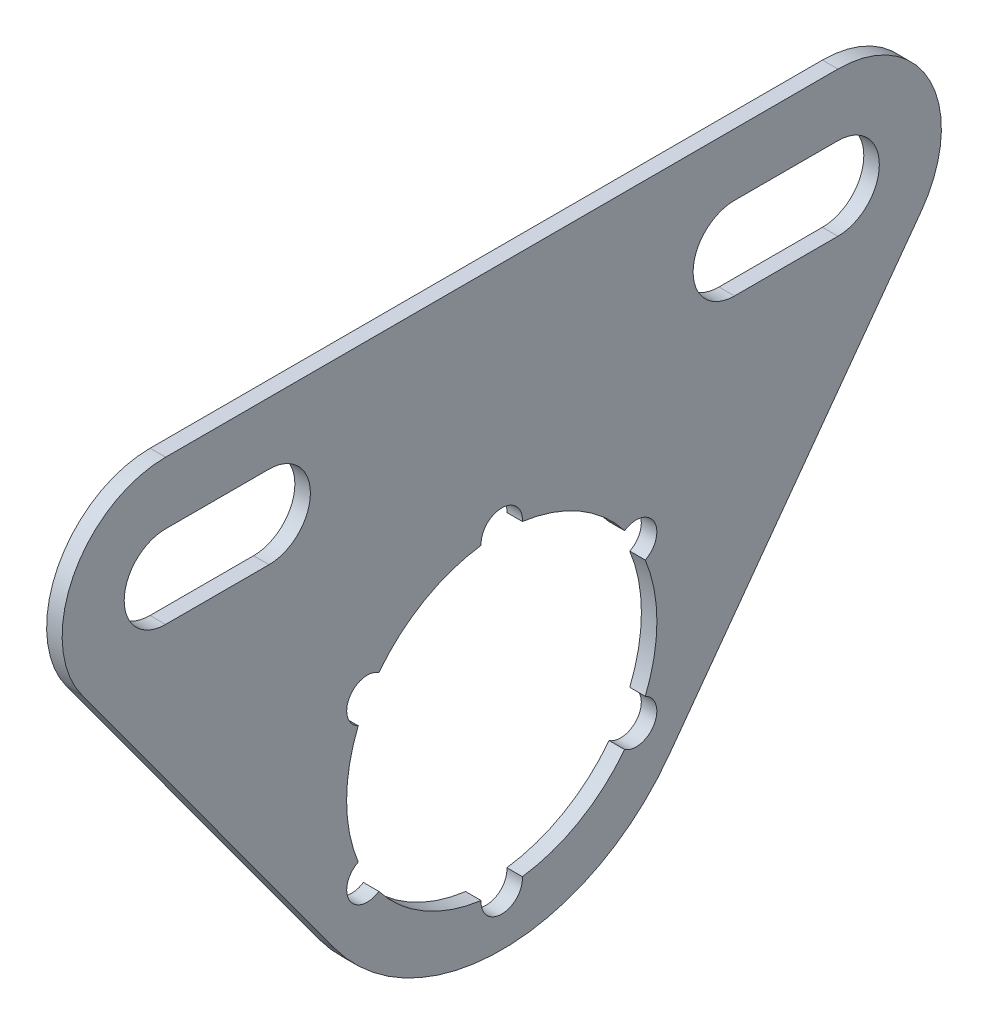
ISO-10303-21;
HEADER;
FILE_DESCRIPTION(('STEP AP214'),'2;1');
FILE_NAME('part.step','',(''),(''),'','','');
FILE_SCHEMA(('AUTOMOTIVE_DESIGN { 1 0 10303 214 1 1 1 1 }'));
ENDSEC;
DATA;
#1=APPLICATION_CONTEXT('core data for automotive mechanical design processes');
#2=APPLICATION_PROTOCOL_DEFINITION('international standard','automotive_design',2000,#1);
#3=PRODUCT_CONTEXT('',#1,'mechanical');
#4=PRODUCT('Part','Part','',(#3));
#5=PRODUCT_RELATED_PRODUCT_CATEGORY('part','',(#4));
#6=PRODUCT_DEFINITION_FORMATION('','',#4);
#7=PRODUCT_DEFINITION_CONTEXT('part definition',#1,'design');
#8=PRODUCT_DEFINITION('design','',#6,#7);
#9=PRODUCT_DEFINITION_SHAPE('','',#8);
#10=(LENGTH_UNIT() NAMED_UNIT(*) SI_UNIT(.MILLI.,.METRE.));
#11=(NAMED_UNIT(*) PLANE_ANGLE_UNIT() SI_UNIT($,.RADIAN.));
#12=(NAMED_UNIT(*) SI_UNIT($,.STERADIAN.) SOLID_ANGLE_UNIT());
#13=UNCERTAINTY_MEASURE_WITH_UNIT(LENGTH_MEASURE(1.E-05),#10,'distance_accuracy_value','');
#14=(GEOMETRIC_REPRESENTATION_CONTEXT(3) GLOBAL_UNCERTAINTY_ASSIGNED_CONTEXT((#13)) GLOBAL_UNIT_ASSIGNED_CONTEXT((#10,
#11,#12)) REPRESENTATION_CONTEXT('',''));
#15=CARTESIAN_POINT('',(0.,0.,0.));
#16=DIRECTION('',(0.,0.,1.));
#17=DIRECTION('',(1.,0.,0.));
#18=AXIS2_PLACEMENT_3D('',#15,#16,#17);
#19=CARTESIAN_POINT('',(3.,-23.6121778819599,32.2872274385817));
#20=DIRECTION('',(0.,0.590304447048994,-0.807180685964538));
#21=DIRECTION('',(0.,0.807180685964538,0.590304447048994));
#22=AXIS2_PLACEMENT_3D('',#19,#20,#21);
#23=PLANE('',#22);
#24=DIRECTION('',(0.,-0.807180685964538,-0.590304447048994));
#25=VECTOR('',#24,1.);
#26=CARTESIAN_POINT('',(0.,-23.6121778819599,32.2872274385817));
#27=LINE('',#26,#25);
#28=CARTESIAN_POINT('',(0.,43.1939110590199,81.1436137192905));
#29=VERTEX_POINT('',#28);
#30=CARTESIAN_POINT('',(0.,-23.6121778819604,32.2872274385814));
#31=VERTEX_POINT('',#30);
#32=EDGE_CURVE('E305',#29,#31,#27,.T.);
#33=ORIENTED_EDGE('',*,*,#32,.T.);
#34=DIRECTION('',(-1.,0.,0.));
#35=VECTOR('',#34,1.);
#36=CARTESIAN_POINT('',(3.,-23.6121778819604,32.2872274385814));
#37=LINE('',#36,#35);
#38=CARTESIAN_POINT('',(3.,-23.6121778819604,32.2872274385814));
#39=VERTEX_POINT('',#38);
#40=EDGE_CURVE('E11',#39,#31,#37,.T.);
#41=ORIENTED_EDGE('',*,*,#40,.F.);
#42=DIRECTION('',(0.,-0.807180685964538,-0.590304447048994));
#43=VECTOR('',#42,1.);
#44=CARTESIAN_POINT('',(3.,-23.6121778819599,32.2872274385817));
#45=LINE('',#44,#43);
#46=CARTESIAN_POINT('',(3.,43.1939110590199,81.1436137192905));
#47=VERTEX_POINT('',#46);
#48=EDGE_CURVE('E434',#47,#39,#45,.T.);
#49=ORIENTED_EDGE('',*,*,#48,.F.);
#50=DIRECTION('',(-1.,0.,0.));
#51=VECTOR('',#50,1.);
#52=CARTESIAN_POINT('',(3.,43.1939110590199,81.1436137192905));
#53=LINE('',#52,#51);
#54=EDGE_CURVE('E319',#47,#29,#53,.T.);
#55=ORIENTED_EDGE('',*,*,#54,.T.);
#56=EDGE_LOOP('',(#33,#41,#49,#55));
#57=FACE_BOUND('',#56,.T.);
#58=ADVANCED_FACE('F39',(#57),#23,.F.);
#59=CARTESIAN_POINT('',(3.,0.,0.));
#60=DIRECTION('',(-1.,0.,0.));
#61=DIRECTION('',(0.,0.,1.));
#62=AXIS2_PLACEMENT_3D('',#59,#60,#61);
#63=CYLINDRICAL_SURFACE('',#62,40.0000000000002);
#64=CARTESIAN_POINT('',(0.,0.,0.));
#65=DIRECTION('',(1.,0.,0.));
#66=DIRECTION('',(0.,0.,-1.));
#67=AXIS2_PLACEMENT_3D('',#64,#65,#66);
#68=CIRCLE('',#67,40.0000000000002);
#69=CARTESIAN_POINT('',(0.,-23.6121778819604,-32.2872274385814));
#70=VERTEX_POINT('',#69);
#71=EDGE_CURVE('E308',#31,#70,#68,.T.);
#72=ORIENTED_EDGE('',*,*,#71,.T.);
#73=DIRECTION('',(-1.,0.,0.));
#74=VECTOR('',#73,1.);
#75=CARTESIAN_POINT('',(3.,-23.6121778819604,-32.2872274385814));
#76=LINE('',#75,#74);
#77=CARTESIAN_POINT('',(3.,-23.6121778819604,-32.2872274385814));
#78=VERTEX_POINT('',#77);
#79=EDGE_CURVE('E49',#78,#70,#76,.T.);
#80=ORIENTED_EDGE('',*,*,#79,.F.);
#81=CARTESIAN_POINT('',(3.,0.,0.));
#82=DIRECTION('',(1.,0.,0.));
#83=DIRECTION('',(0.,0.,-1.));
#84=AXIS2_PLACEMENT_3D('',#81,#82,#83);
#85=CIRCLE('',#84,40.0000000000002);
#86=EDGE_CURVE('E436',#39,#78,#85,.T.);
#87=ORIENTED_EDGE('',*,*,#86,.F.);
#88=ORIENTED_EDGE('',*,*,#40,.T.);
#89=EDGE_LOOP('',(#72,#80,#87,#88));
#90=FACE_BOUND('',#89,.T.);
#91=ADVANCED_FACE('F461',(#90),#63,.T.);
#92=CARTESIAN_POINT('',(3.,-23.6121778819599,-32.2872274385817));
#93=DIRECTION('',(0.,-0.590304447048994,-0.807180685964538));
#94=DIRECTION('',(0.,0.807180685964538,-0.590304447048994));
#95=AXIS2_PLACEMENT_3D('',#92,#93,#94);
#96=PLANE('',#95);
#97=DIRECTION('',(0.,-0.807180685964538,0.590304447048994));
#98=VECTOR('',#97,1.);
#99=CARTESIAN_POINT('',(0.,-23.6121778819599,-32.2872274385817));
#100=LINE('',#99,#98);
#101=CARTESIAN_POINT('',(0.,43.1939110590199,-81.1436137192905));
#102=VERTEX_POINT('',#101);
#103=EDGE_CURVE('E311',#102,#70,#100,.T.);
#104=ORIENTED_EDGE('',*,*,#103,.F.);
#105=DIRECTION('',(-1.,0.,0.));
#106=VECTOR('',#105,1.);
#107=CARTESIAN_POINT('',(3.,43.1939110590199,-81.1436137192905));
#108=LINE('',#107,#106);
#109=CARTESIAN_POINT('',(3.,43.1939110590199,-81.1436137192905));
#110=VERTEX_POINT('',#109);
#111=EDGE_CURVE('E237',#110,#102,#108,.T.);
#112=ORIENTED_EDGE('',*,*,#111,.F.);
#113=DIRECTION('',(0.,-0.807180685964538,0.590304447048994));
#114=VECTOR('',#113,1.);
#115=CARTESIAN_POINT('',(3.,-23.6121778819599,-32.2872274385817));
#116=LINE('',#115,#114);
#117=EDGE_CURVE('E226',#110,#78,#116,.T.);
#118=ORIENTED_EDGE('',*,*,#117,.T.);
#119=ORIENTED_EDGE('',*,*,#79,.T.);
#120=EDGE_LOOP('',(#104,#112,#118,#119));
#121=FACE_BOUND('',#120,.T.);
#122=ADVANCED_FACE('F439',(#121),#96,.T.);
#123=CARTESIAN_POINT('',(3.,55.,-65.));
#124=DIRECTION('',(-1.,0.,0.));
#125=DIRECTION('',(0.,0.,1.));
#126=AXIS2_PLACEMENT_3D('',#123,#124,#125);
#127=CYLINDRICAL_SURFACE('',#126,20.);
#128=CARTESIAN_POINT('',(0.,55.,-65.));
#129=DIRECTION('',(1.,0.,0.));
#130=DIRECTION('',(0.,0.,-1.));
#131=AXIS2_PLACEMENT_3D('',#128,#129,#130);
#132=CIRCLE('',#131,20.);
#133=CARTESIAN_POINT('',(0.,75.,-65.));
#134=VERTEX_POINT('',#133);
#135=EDGE_CURVE('E233',#102,#134,#132,.T.);
#136=ORIENTED_EDGE('',*,*,#135,.T.);
#137=DIRECTION('',(-1.,0.,0.));
#138=VECTOR('',#137,1.);
#139=CARTESIAN_POINT('',(3.,75.,-65.));
#140=LINE('',#139,#138);
#141=CARTESIAN_POINT('',(3.,75.,-65.));
#142=VERTEX_POINT('',#141);
#143=EDGE_CURVE('E230',#142,#134,#140,.T.);
#144=ORIENTED_EDGE('',*,*,#143,.F.);
#145=CARTESIAN_POINT('',(3.,55.,-65.));
#146=DIRECTION('',(1.,0.,0.));
#147=DIRECTION('',(0.,0.,-1.));
#148=AXIS2_PLACEMENT_3D('',#145,#146,#147);
#149=CIRCLE('',#148,20.);
#150=EDGE_CURVE('E220',#110,#142,#149,.T.);
#151=ORIENTED_EDGE('',*,*,#150,.F.);
#152=ORIENTED_EDGE('',*,*,#111,.T.);
#153=EDGE_LOOP('',(#136,#144,#151,#152));
#154=FACE_BOUND('',#153,.T.);
#155=ADVANCED_FACE('F231',(#154),#127,.T.);
#156=CARTESIAN_POINT('',(3.,75.,0.));
#157=DIRECTION('',(0.,1.,0.));
#158=DIRECTION('',(0.,0.,1.));
#159=AXIS2_PLACEMENT_3D('',#156,#157,#158);
#160=PLANE('',#159);
#161=DIRECTION('',(0.,0.,-1.));
#162=VECTOR('',#161,1.);
#163=CARTESIAN_POINT('',(0.,75.,0.));
#164=LINE('',#163,#162);
#165=CARTESIAN_POINT('',(0.,75.,65.));
#166=VERTEX_POINT('',#165);
#167=EDGE_CURVE('E315',#166,#134,#164,.T.);
#168=ORIENTED_EDGE('',*,*,#167,.F.);
#169=DIRECTION('',(-1.,0.,0.));
#170=VECTOR('',#169,1.);
#171=CARTESIAN_POINT('',(3.,75.,65.));
#172=LINE('',#171,#170);
#173=CARTESIAN_POINT('',(3.,75.,65.));
#174=VERTEX_POINT('',#173);
#175=EDGE_CURVE('E140',#174,#166,#172,.T.);
#176=ORIENTED_EDGE('',*,*,#175,.F.);
#177=DIRECTION('',(0.,0.,-1.));
#178=VECTOR('',#177,1.);
#179=CARTESIAN_POINT('',(3.,75.,0.));
#180=LINE('',#179,#178);
#181=EDGE_CURVE('E224',#174,#142,#180,.T.);
#182=ORIENTED_EDGE('',*,*,#181,.T.);
#183=ORIENTED_EDGE('',*,*,#143,.T.);
#184=EDGE_LOOP('',(#168,#176,#182,#183));
#185=FACE_BOUND('',#184,.T.);
#186=ADVANCED_FACE('F239',(#185),#160,.T.);
#187=CARTESIAN_POINT('',(3.,55.,45.));
#188=DIRECTION('',(-1.,0.,0.));
#189=DIRECTION('',(0.,0.,1.));
#190=AXIS2_PLACEMENT_3D('',#187,#188,#189);
#191=CYLINDRICAL_SURFACE('',#190,8.00000000000001);
#192=CARTESIAN_POINT('',(0.,55.,45.));
#193=DIRECTION('',(1.,0.,0.));
#194=DIRECTION('',(0.,0.,-1.));
#195=AXIS2_PLACEMENT_3D('',#192,#193,#194);
#196=CIRCLE('',#195,8.00000000000001);
#197=CARTESIAN_POINT('',(0.,47.,45.));
#198=VERTEX_POINT('',#197);
#199=CARTESIAN_POINT('',(0.,63.,45.));
#200=VERTEX_POINT('',#199);
#201=EDGE_CURVE('E293',#198,#200,#196,.T.);
#202=ORIENTED_EDGE('',*,*,#201,.F.);
#203=DIRECTION('',(-1.,0.,0.));
#204=VECTOR('',#203,1.);
#205=CARTESIAN_POINT('',(3.,47.,45.));
#206=LINE('',#205,#204);
#207=CARTESIAN_POINT('',(3.,47.,45.));
#208=VERTEX_POINT('',#207);
#209=EDGE_CURVE('E321',#208,#198,#206,.T.);
#210=ORIENTED_EDGE('',*,*,#209,.F.);
#211=CARTESIAN_POINT('',(3.,55.,45.));
#212=DIRECTION('',(1.,0.,0.));
#213=DIRECTION('',(0.,0.,-1.));
#214=AXIS2_PLACEMENT_3D('',#211,#212,#213);
#215=CIRCLE('',#214,8.00000000000001);
#216=CARTESIAN_POINT('',(3.,63.,45.));
#217=VERTEX_POINT('',#216);
#218=EDGE_CURVE('E423',#208,#217,#215,.T.);
#219=ORIENTED_EDGE('',*,*,#218,.T.);
#220=DIRECTION('',(-1.,0.,0.));
#221=VECTOR('',#220,1.);
#222=CARTESIAN_POINT('',(3.,63.,45.));
#223=LINE('',#222,#221);
#224=EDGE_CURVE('E325',#217,#200,#223,.T.);
#225=ORIENTED_EDGE('',*,*,#224,.T.);
#226=EDGE_LOOP('',(#202,#210,#219,#225));
#227=FACE_BOUND('',#226,.T.);
#228=ADVANCED_FACE('F483',(#227),#191,.F.);
#229=CARTESIAN_POINT('',(3.,47.,0.));
#230=DIRECTION('',(0.,1.,0.));
#231=DIRECTION('',(0.,0.,1.));
#232=AXIS2_PLACEMENT_3D('',#229,#230,#231);
#233=PLANE('',#232);
#234=DIRECTION('',(0.,0.,-1.));
#235=VECTOR('',#234,1.);
#236=CARTESIAN_POINT('',(0.,47.,0.));
#237=LINE('',#236,#235);
#238=CARTESIAN_POINT('',(0.,47.,65.));
#239=VERTEX_POINT('',#238);
#240=EDGE_CURVE('E296',#239,#198,#237,.T.);
#241=ORIENTED_EDGE('',*,*,#240,.F.);
#242=DIRECTION('',(-1.,0.,0.));
#243=VECTOR('',#242,1.);
#244=CARTESIAN_POINT('',(3.,47.,65.));
#245=LINE('',#244,#243);
#246=CARTESIAN_POINT('',(3.,47.,65.));
#247=VERTEX_POINT('',#246);
#248=EDGE_CURVE('E330',#247,#239,#245,.T.);
#249=ORIENTED_EDGE('',*,*,#248,.F.);
#250=DIRECTION('',(0.,0.,-1.));
#251=VECTOR('',#250,1.);
#252=CARTESIAN_POINT('',(3.,47.,0.));
#253=LINE('',#252,#251);
#254=EDGE_CURVE('E426',#247,#208,#253,.T.);
#255=ORIENTED_EDGE('',*,*,#254,.T.);
#256=ORIENTED_EDGE('',*,*,#209,.T.);
#257=EDGE_LOOP('',(#241,#249,#255,#256));
#258=FACE_BOUND('',#257,.T.);
#259=ADVANCED_FACE('F479',(#258),#233,.T.);
#260=CARTESIAN_POINT('',(3.,55.,65.));
#261=DIRECTION('',(-1.,0.,0.));
#262=DIRECTION('',(0.,0.,1.));
#263=AXIS2_PLACEMENT_3D('',#260,#261,#262);
#264=CYLINDRICAL_SURFACE('',#263,8.);
#265=CARTESIAN_POINT('',(0.,55.,65.));
#266=DIRECTION('',(1.,0.,0.));
#267=DIRECTION('',(0.,0.,-1.));
#268=AXIS2_PLACEMENT_3D('',#265,#266,#267);
#269=CIRCLE('',#268,8.);
#270=CARTESIAN_POINT('',(0.,63.,65.));
#271=VERTEX_POINT('',#270);
#272=EDGE_CURVE('E299',#271,#239,#269,.T.);
#273=ORIENTED_EDGE('',*,*,#272,.F.);
#274=DIRECTION('',(-1.,0.,0.));
#275=VECTOR('',#274,1.);
#276=CARTESIAN_POINT('',(3.,63.,65.));
#277=LINE('',#276,#275);
#278=CARTESIAN_POINT('',(3.,63.,65.));
#279=VERTEX_POINT('',#278);
#280=EDGE_CURVE('E327',#279,#271,#277,.T.);
#281=ORIENTED_EDGE('',*,*,#280,.F.);
#282=CARTESIAN_POINT('',(3.,55.,65.));
#283=DIRECTION('',(1.,0.,0.));
#284=DIRECTION('',(0.,0.,-1.));
#285=AXIS2_PLACEMENT_3D('',#282,#283,#284);
#286=CIRCLE('',#285,8.);
#287=EDGE_CURVE('E429',#279,#247,#286,.T.);
#288=ORIENTED_EDGE('',*,*,#287,.T.);
#289=ORIENTED_EDGE('',*,*,#248,.T.);
#290=EDGE_LOOP('',(#273,#281,#288,#289));
#291=FACE_BOUND('',#290,.T.);
#292=ADVANCED_FACE('F475',(#291),#264,.F.);
#293=CARTESIAN_POINT('',(3.,55.,-45.));
#294=DIRECTION('',(-1.,0.,0.));
#295=DIRECTION('',(0.,0.,1.));
#296=AXIS2_PLACEMENT_3D('',#293,#294,#295);
#297=CYLINDRICAL_SURFACE('',#296,8.);
#298=CARTESIAN_POINT('',(0.,55.,-45.));
#299=DIRECTION('',(1.,0.,0.));
#300=DIRECTION('',(0.,0.,-1.));
#301=AXIS2_PLACEMENT_3D('',#298,#299,#300);
#302=CIRCLE('',#301,8.);
#303=CARTESIAN_POINT('',(0.,63.,-45.));
#304=VERTEX_POINT('',#303);
#305=CARTESIAN_POINT('',(0.,47.,-45.));
#306=VERTEX_POINT('',#305);
#307=EDGE_CURVE('E281',#304,#306,#302,.T.);
#308=ORIENTED_EDGE('',*,*,#307,.F.);
#309=DIRECTION('',(-1.,0.,0.));
#310=VECTOR('',#309,1.);
#311=CARTESIAN_POINT('',(3.,63.,-45.));
#312=LINE('',#311,#310);
#313=CARTESIAN_POINT('',(3.,63.,-45.));
#314=VERTEX_POINT('',#313);
#315=EDGE_CURVE('E328',#314,#304,#312,.T.);
#316=ORIENTED_EDGE('',*,*,#315,.F.);
#317=CARTESIAN_POINT('',(3.,55.,-45.));
#318=DIRECTION('',(1.,0.,0.));
#319=DIRECTION('',(0.,0.,-1.));
#320=AXIS2_PLACEMENT_3D('',#317,#318,#319);
#321=CIRCLE('',#320,8.);
#322=CARTESIAN_POINT('',(3.,47.,-45.));
#323=VERTEX_POINT('',#322);
#324=EDGE_CURVE('E412',#314,#323,#321,.T.);
#325=ORIENTED_EDGE('',*,*,#324,.T.);
#326=DIRECTION('',(-1.,0.,0.));
#327=VECTOR('',#326,1.);
#328=CARTESIAN_POINT('',(3.,47.,-45.));
#329=LINE('',#328,#327);
#330=EDGE_CURVE('E333',#323,#306,#329,.T.);
#331=ORIENTED_EDGE('',*,*,#330,.T.);
#332=EDGE_LOOP('',(#308,#316,#325,#331));
#333=FACE_BOUND('',#332,.T.);
#334=ADVANCED_FACE('F478',(#333),#297,.F.);
#335=CARTESIAN_POINT('',(3.,63.,0.));
#336=DIRECTION('',(0.,-1.,0.));
#337=DIRECTION('',(0.,0.,-1.));
#338=AXIS2_PLACEMENT_3D('',#335,#336,#337);
#339=PLANE('',#338);
#340=DIRECTION('',(0.,0.,1.));
#341=VECTOR('',#340,1.);
#342=CARTESIAN_POINT('',(0.,63.,0.));
#343=LINE('',#342,#341);
#344=CARTESIAN_POINT('',(0.,63.,-65.));
#345=VERTEX_POINT('',#344);
#346=EDGE_CURVE('E284',#345,#304,#343,.T.);
#347=ORIENTED_EDGE('',*,*,#346,.F.);
#348=DIRECTION('',(-1.,0.,0.));
#349=VECTOR('',#348,1.);
#350=CARTESIAN_POINT('',(3.,63.,-65.));
#351=LINE('',#350,#349);
#352=CARTESIAN_POINT('',(3.,63.,-65.));
#353=VERTEX_POINT('',#352);
#354=EDGE_CURVE('E337',#353,#345,#351,.T.);
#355=ORIENTED_EDGE('',*,*,#354,.F.);
#356=DIRECTION('',(0.,0.,1.));
#357=VECTOR('',#356,1.);
#358=CARTESIAN_POINT('',(3.,63.,0.));
#359=LINE('',#358,#357);
#360=EDGE_CURVE('E415',#353,#314,#359,.T.);
#361=ORIENTED_EDGE('',*,*,#360,.T.);
#362=ORIENTED_EDGE('',*,*,#315,.T.);
#363=EDGE_LOOP('',(#347,#355,#361,#362));
#364=FACE_BOUND('',#363,.T.);
#365=ADVANCED_FACE('F494',(#364),#339,.T.);
#366=CARTESIAN_POINT('',(3.,55.,-65.));
#367=DIRECTION('',(-1.,0.,0.));
#368=DIRECTION('',(0.,0.,1.));
#369=AXIS2_PLACEMENT_3D('',#366,#367,#368);
#370=CYLINDRICAL_SURFACE('',#369,8.);
#371=CARTESIAN_POINT('',(0.,55.,-65.));
#372=DIRECTION('',(1.,0.,0.));
#373=DIRECTION('',(0.,0.,-1.));
#374=AXIS2_PLACEMENT_3D('',#371,#372,#373);
#375=CIRCLE('',#374,8.);
#376=CARTESIAN_POINT('',(0.,47.,-65.));
#377=VERTEX_POINT('',#376);
#378=EDGE_CURVE('E287',#377,#345,#375,.T.);
#379=ORIENTED_EDGE('',*,*,#378,.F.);
#380=DIRECTION('',(-1.,0.,0.));
#381=VECTOR('',#380,1.);
#382=CARTESIAN_POINT('',(3.,47.,-65.));
#383=LINE('',#382,#381);
#384=CARTESIAN_POINT('',(3.,47.,-65.));
#385=VERTEX_POINT('',#384);
#386=EDGE_CURVE('E335',#385,#377,#383,.T.);
#387=ORIENTED_EDGE('',*,*,#386,.F.);
#388=CARTESIAN_POINT('',(3.,55.,-65.));
#389=DIRECTION('',(1.,0.,0.));
#390=DIRECTION('',(0.,0.,-1.));
#391=AXIS2_PLACEMENT_3D('',#388,#389,#390);
#392=CIRCLE('',#391,8.);
#393=EDGE_CURVE('E418',#385,#353,#392,.T.);
#394=ORIENTED_EDGE('',*,*,#393,.T.);
#395=ORIENTED_EDGE('',*,*,#354,.T.);
#396=EDGE_LOOP('',(#379,#387,#394,#395));
#397=FACE_BOUND('',#396,.T.);
#398=ADVANCED_FACE('F491',(#397),#370,.F.);
#399=CARTESIAN_POINT('',(3.,0.,0.));
#400=DIRECTION('',(-1.,0.,0.));
#401=DIRECTION('',(0.,0.,1.));
#402=AXIS2_PLACEMENT_3D('',#399,#400,#401);
#403=CYLINDRICAL_SURFACE('',#402,30.);
#404=CARTESIAN_POINT('',(0.,0.,0.));
#405=DIRECTION('',(1.,0.,0.));
#406=DIRECTION('',(0.,0.,-1.));
#407=AXIS2_PLACEMENT_3D('',#404,#405,#406);
#408=CIRCLE('',#407,30.);
#409=CARTESIAN_POINT('',(0.,-18.3230617058175,23.7542713995779));
#410=VERTEX_POINT('',#409);
#411=CARTESIAN_POINT('',(0.,-29.7333333333333,3.99110121255887));
#412=VERTEX_POINT('',#411);
#413=EDGE_CURVE('E245',#410,#412,#408,.T.);
#414=ORIENTED_EDGE('',*,*,#413,.F.);
#415=DIRECTION('',(-1.,0.,0.));
#416=VECTOR('',#415,1.);
#417=CARTESIAN_POINT('',(3.,-18.3230617058175,23.7542713995779));
#418=LINE('',#417,#416);
#419=CARTESIAN_POINT('',(3.,-18.3230617058175,23.7542713995779));
#420=VERTEX_POINT('',#419);
#421=EDGE_CURVE('E43',#420,#410,#418,.T.);
#422=ORIENTED_EDGE('',*,*,#421,.F.);
#423=CARTESIAN_POINT('',(3.,0.,0.));
#424=DIRECTION('',(1.,0.,0.));
#425=DIRECTION('',(0.,0.,-1.));
#426=AXIS2_PLACEMENT_3D('',#423,#424,#425);
#427=CIRCLE('',#426,30.);
#428=CARTESIAN_POINT('',(3.,-29.7333333333333,3.99110121255887));
#429=VERTEX_POINT('',#428);
#430=EDGE_CURVE('E318',#420,#429,#427,.T.);
#431=ORIENTED_EDGE('',*,*,#430,.T.);
#432=DIRECTION('',(-1.,0.,0.));
#433=VECTOR('',#432,1.);
#434=CARTESIAN_POINT('',(3.,-29.7333333333333,3.99110121255887));
#435=LINE('',#434,#433);
#436=EDGE_CURVE('E241',#429,#412,#435,.T.);
#437=ORIENTED_EDGE('',*,*,#436,.T.);
#438=EDGE_LOOP('',(#414,#422,#431,#437));
#439=FACE_BOUND('',#438,.T.);
#440=ADVANCED_FACE('F41',(#439),#403,.F.);
#441=CARTESIAN_POINT('',(3.,-15.,25.9807621135332));
#442=DIRECTION('',(-1.,0.,0.));
#443=DIRECTION('',(0.,0.,1.));
#444=AXIS2_PLACEMENT_3D('',#441,#442,#443);
#445=CYLINDRICAL_SURFACE('',#444,4.);
#446=CARTESIAN_POINT('',(0.,-15.,25.9807621135332));
#447=DIRECTION('',(1.,0.,0.));
#448=DIRECTION('',(0.,0.,-1.));
#449=AXIS2_PLACEMENT_3D('',#446,#447,#448);
#450=CIRCLE('',#449,4.);
#451=CARTESIAN_POINT('',(0.,-11.4102716275158,27.7453726121367));
#452=VERTEX_POINT('',#451);
#453=EDGE_CURVE('E248',#452,#410,#450,.T.);
#454=ORIENTED_EDGE('',*,*,#453,.F.);
#455=DIRECTION('',(-1.,0.,0.));
#456=VECTOR('',#455,1.);
#457=CARTESIAN_POINT('',(3.,-11.4102716275158,27.7453726121367));
#458=LINE('',#457,#456);
#459=CARTESIAN_POINT('',(3.,-11.4102716275158,27.7453726121367));
#460=VERTEX_POINT('',#459);
#461=EDGE_CURVE('E358',#460,#452,#458,.T.);
#462=ORIENTED_EDGE('',*,*,#461,.F.);
#463=CARTESIAN_POINT('',(3.,-15.,25.9807621135332));
#464=DIRECTION('',(1.,0.,0.));
#465=DIRECTION('',(0.,0.,-1.));
#466=AXIS2_PLACEMENT_3D('',#463,#464,#465);
#467=CIRCLE('',#466,4.);
#468=EDGE_CURVE('E367',#460,#420,#467,.T.);
#469=ORIENTED_EDGE('',*,*,#468,.T.);
#470=ORIENTED_EDGE('',*,*,#421,.T.);
#471=EDGE_LOOP('',(#454,#462,#469,#470));
#472=FACE_BOUND('',#471,.T.);
#473=ADVANCED_FACE('F365',(#472),#445,.F.);
#474=CARTESIAN_POINT('',(3.,0.,0.));
#475=DIRECTION('',(-1.,0.,0.));
#476=DIRECTION('',(0.,0.,1.));
#477=AXIS2_PLACEMENT_3D('',#474,#475,#476);
#478=CYLINDRICAL_SURFACE('',#477,30.);
#479=CARTESIAN_POINT('',(0.,0.,0.));
#480=DIRECTION('',(1.,0.,0.));
#481=DIRECTION('',(0.,0.,-1.));
#482=AXIS2_PLACEMENT_3D('',#479,#480,#481);
#483=CIRCLE('',#482,30.);
#484=CARTESIAN_POINT('',(0.,11.4102716275158,27.7453726121367));
#485=VERTEX_POINT('',#484);
#486=EDGE_CURVE('E251',#485,#452,#483,.T.);
#487=ORIENTED_EDGE('',*,*,#486,.F.);
#488=DIRECTION('',(-1.,0.,0.));
#489=VECTOR('',#488,1.);
#490=CARTESIAN_POINT('',(3.,11.4102716275158,27.7453726121367));
#491=LINE('',#490,#489);
#492=CARTESIAN_POINT('',(3.,11.4102716275158,27.7453726121367));
#493=VERTEX_POINT('',#492);
#494=EDGE_CURVE('E357',#493,#485,#491,.T.);
#495=ORIENTED_EDGE('',*,*,#494,.F.);
#496=CARTESIAN_POINT('',(3.,0.,0.));
#497=DIRECTION('',(1.,0.,0.));
#498=DIRECTION('',(0.,0.,-1.));
#499=AXIS2_PLACEMENT_3D('',#496,#497,#498);
#500=CIRCLE('',#499,30.);
#501=EDGE_CURVE('E375',#493,#460,#500,.T.);
#502=ORIENTED_EDGE('',*,*,#501,.T.);
#503=ORIENTED_EDGE('',*,*,#461,.T.);
#504=EDGE_LOOP('',(#487,#495,#502,#503));
#505=FACE_BOUND('',#504,.T.);
#506=ADVANCED_FACE('F373',(#505),#478,.F.);
#507=CARTESIAN_POINT('',(3.,15.,25.9807621135332));
#508=DIRECTION('',(-1.,0.,0.));
#509=DIRECTION('',(0.,0.,1.));
#510=AXIS2_PLACEMENT_3D('',#507,#508,#509);
#511=CYLINDRICAL_SURFACE('',#510,4.);
#512=CARTESIAN_POINT('',(0.,15.,25.9807621135332));
#513=DIRECTION('',(1.,0.,0.));
#514=DIRECTION('',(0.,0.,-1.));
#515=AXIS2_PLACEMENT_3D('',#512,#513,#514);
#516=CIRCLE('',#515,4.);
#517=CARTESIAN_POINT('',(0.,18.3230617058175,23.7542713995779));
#518=VERTEX_POINT('',#517);
#519=EDGE_CURVE('E254',#518,#485,#516,.T.);
#520=ORIENTED_EDGE('',*,*,#519,.F.);
#521=DIRECTION('',(-1.,0.,0.));
#522=VECTOR('',#521,1.);
#523=CARTESIAN_POINT('',(3.,18.3230617058175,23.7542713995779));
#524=LINE('',#523,#522);
#525=CARTESIAN_POINT('',(3.,18.3230617058175,23.7542713995779));
#526=VERTEX_POINT('',#525);
#527=EDGE_CURVE('E355',#526,#518,#524,.T.);
#528=ORIENTED_EDGE('',*,*,#527,.F.);
#529=CARTESIAN_POINT('',(3.,15.,25.9807621135332));
#530=DIRECTION('',(1.,0.,0.));
#531=DIRECTION('',(0.,0.,-1.));
#532=AXIS2_PLACEMENT_3D('',#529,#530,#531);
#533=CIRCLE('',#532,4.);
#534=EDGE_CURVE('E382',#526,#493,#533,.T.);
#535=ORIENTED_EDGE('',*,*,#534,.T.);
#536=ORIENTED_EDGE('',*,*,#494,.T.);
#537=EDGE_LOOP('',(#520,#528,#535,#536));
#538=FACE_BOUND('',#537,.T.);
#539=ADVANCED_FACE('F385',(#538),#511,.F.);
#540=CARTESIAN_POINT('',(3.,0.,0.));
#541=DIRECTION('',(-1.,0.,0.));
#542=DIRECTION('',(0.,0.,1.));
#543=AXIS2_PLACEMENT_3D('',#540,#541,#542);
#544=CYLINDRICAL_SURFACE('',#543,30.);
#545=CARTESIAN_POINT('',(0.,0.,0.));
#546=DIRECTION('',(1.,0.,0.));
#547=DIRECTION('',(0.,0.,-1.));
#548=AXIS2_PLACEMENT_3D('',#545,#546,#547);
#549=CIRCLE('',#548,30.);
#550=CARTESIAN_POINT('',(0.,29.7333333333333,3.99110121255887));
#551=VERTEX_POINT('',#550);
#552=EDGE_CURVE('E257',#551,#518,#549,.T.);
#553=ORIENTED_EDGE('',*,*,#552,.F.);
#554=DIRECTION('',(-1.,0.,0.));
#555=VECTOR('',#554,1.);
#556=CARTESIAN_POINT('',(3.,29.7333333333333,3.99110121255887));
#557=LINE('',#556,#555);
#558=CARTESIAN_POINT('',(3.,29.7333333333333,3.99110121255887));
#559=VERTEX_POINT('',#558);
#560=EDGE_CURVE('E353',#559,#551,#557,.T.);
#561=ORIENTED_EDGE('',*,*,#560,.F.);
#562=CARTESIAN_POINT('',(3.,0.,0.));
#563=DIRECTION('',(1.,0.,0.));
#564=DIRECTION('',(0.,0.,-1.));
#565=AXIS2_PLACEMENT_3D('',#562,#563,#564);
#566=CIRCLE('',#565,30.);
#567=EDGE_CURVE('E386',#559,#526,#566,.T.);
#568=ORIENTED_EDGE('',*,*,#567,.T.);
#569=ORIENTED_EDGE('',*,*,#527,.T.);
#570=EDGE_LOOP('',(#553,#561,#568,#569));
#571=FACE_BOUND('',#570,.T.);
#572=ADVANCED_FACE('F524',(#571),#544,.F.);
#573=CARTESIAN_POINT('',(3.,30.,0.));
#574=DIRECTION('',(-1.,0.,0.));
#575=DIRECTION('',(0.,0.,1.));
#576=AXIS2_PLACEMENT_3D('',#573,#574,#575);
#577=CYLINDRICAL_SURFACE('',#576,4.);
#578=CARTESIAN_POINT('',(0.,30.,0.));
#579=DIRECTION('',(1.,0.,0.));
#580=DIRECTION('',(0.,0.,-1.));
#581=AXIS2_PLACEMENT_3D('',#578,#579,#580);
#582=CIRCLE('',#581,4.);
#583=CARTESIAN_POINT('',(0.,29.7333333333333,-3.99110121255887));
#584=VERTEX_POINT('',#583);
#585=EDGE_CURVE('E260',#584,#551,#582,.T.);
#586=ORIENTED_EDGE('',*,*,#585,.F.);
#587=DIRECTION('',(-1.,0.,0.));
#588=VECTOR('',#587,1.);
#589=CARTESIAN_POINT('',(3.,29.7333333333333,-3.99110121255887));
#590=LINE('',#589,#588);
#591=CARTESIAN_POINT('',(3.,29.7333333333333,-3.99110121255887));
#592=VERTEX_POINT('',#591);
#593=EDGE_CURVE('E351',#592,#584,#590,.T.);
#594=ORIENTED_EDGE('',*,*,#593,.F.);
#595=CARTESIAN_POINT('',(3.,30.,0.));
#596=DIRECTION('',(1.,0.,0.));
#597=DIRECTION('',(0.,0.,-1.));
#598=AXIS2_PLACEMENT_3D('',#595,#596,#597);
#599=CIRCLE('',#598,4.);
#600=EDGE_CURVE('E388',#592,#559,#599,.T.);
#601=ORIENTED_EDGE('',*,*,#600,.T.);
#602=ORIENTED_EDGE('',*,*,#560,.T.);
#603=EDGE_LOOP('',(#586,#594,#601,#602));
#604=FACE_BOUND('',#603,.T.);
#605=ADVANCED_FACE('F520',(#604),#577,.F.);
#606=CARTESIAN_POINT('',(3.,0.,0.));
#607=DIRECTION('',(-1.,0.,0.));
#608=DIRECTION('',(0.,0.,1.));
#609=AXIS2_PLACEMENT_3D('',#606,#607,#608);
#610=CYLINDRICAL_SURFACE('',#609,30.);
#611=CARTESIAN_POINT('',(0.,0.,0.));
#612=DIRECTION('',(1.,0.,0.));
#613=DIRECTION('',(0.,0.,-1.));
#614=AXIS2_PLACEMENT_3D('',#611,#612,#613);
#615=CIRCLE('',#614,30.);
#616=CARTESIAN_POINT('',(0.,18.3230617058175,-23.7542713995779));
#617=VERTEX_POINT('',#616);
#618=EDGE_CURVE('E263',#617,#584,#615,.T.);
#619=ORIENTED_EDGE('',*,*,#618,.F.);
#620=DIRECTION('',(-1.,0.,0.));
#621=VECTOR('',#620,1.);
#622=CARTESIAN_POINT('',(3.,18.3230617058175,-23.7542713995779));
#623=LINE('',#622,#621);
#624=CARTESIAN_POINT('',(3.,18.3230617058175,-23.7542713995779));
#625=VERTEX_POINT('',#624);
#626=EDGE_CURVE('E349',#625,#617,#623,.T.);
#627=ORIENTED_EDGE('',*,*,#626,.F.);
#628=CARTESIAN_POINT('',(3.,0.,0.));
#629=DIRECTION('',(1.,0.,0.));
#630=DIRECTION('',(0.,0.,-1.));
#631=AXIS2_PLACEMENT_3D('',#628,#629,#630);
#632=CIRCLE('',#631,30.);
#633=EDGE_CURVE('E394',#625,#592,#632,.T.);
#634=ORIENTED_EDGE('',*,*,#633,.T.);
#635=ORIENTED_EDGE('',*,*,#593,.T.);
#636=EDGE_LOOP('',(#619,#627,#634,#635));
#637=FACE_BOUND('',#636,.T.);
#638=ADVANCED_FACE('F516',(#637),#610,.F.);
#639=CARTESIAN_POINT('',(3.,15.,-25.9807621135332));
#640=DIRECTION('',(-1.,0.,0.));
#641=DIRECTION('',(0.,0.,1.));
#642=AXIS2_PLACEMENT_3D('',#639,#640,#641);
#643=CYLINDRICAL_SURFACE('',#642,4.);
#644=CARTESIAN_POINT('',(0.,15.,-25.9807621135332));
#645=DIRECTION('',(1.,0.,0.));
#646=DIRECTION('',(0.,0.,-1.));
#647=AXIS2_PLACEMENT_3D('',#644,#645,#646);
#648=CIRCLE('',#647,4.);
#649=CARTESIAN_POINT('',(0.,11.4102716275158,-27.7453726121367));
#650=VERTEX_POINT('',#649);
#651=EDGE_CURVE('E266',#650,#617,#648,.T.);
#652=ORIENTED_EDGE('',*,*,#651,.F.);
#653=DIRECTION('',(-1.,0.,0.));
#654=VECTOR('',#653,1.);
#655=CARTESIAN_POINT('',(3.,11.4102716275158,-27.7453726121367));
#656=LINE('',#655,#654);
#657=CARTESIAN_POINT('',(3.,11.4102716275158,-27.7453726121367));
#658=VERTEX_POINT('',#657);
#659=EDGE_CURVE('E347',#658,#650,#656,.T.);
#660=ORIENTED_EDGE('',*,*,#659,.F.);
#661=CARTESIAN_POINT('',(3.,15.,-25.9807621135332));
#662=DIRECTION('',(1.,0.,0.));
#663=DIRECTION('',(0.,0.,-1.));
#664=AXIS2_PLACEMENT_3D('',#661,#662,#663);
#665=CIRCLE('',#664,4.);
#666=EDGE_CURVE('E397',#658,#625,#665,.T.);
#667=ORIENTED_EDGE('',*,*,#666,.T.);
#668=ORIENTED_EDGE('',*,*,#626,.T.);
#669=EDGE_LOOP('',(#652,#660,#667,#668));
#670=FACE_BOUND('',#669,.T.);
#671=ADVANCED_FACE('F512',(#670),#643,.F.);
#672=CARTESIAN_POINT('',(3.,0.,0.));
#673=DIRECTION('',(-1.,0.,0.));
#674=DIRECTION('',(0.,0.,1.));
#675=AXIS2_PLACEMENT_3D('',#672,#673,#674);
#676=CYLINDRICAL_SURFACE('',#675,30.);
#677=CARTESIAN_POINT('',(0.,0.,0.));
#678=DIRECTION('',(1.,0.,0.));
#679=DIRECTION('',(0.,0.,-1.));
#680=AXIS2_PLACEMENT_3D('',#677,#678,#679);
#681=CIRCLE('',#680,30.);
#682=CARTESIAN_POINT('',(0.,-11.4102716275158,-27.7453726121368));
#683=VERTEX_POINT('',#682);
#684=EDGE_CURVE('E269',#683,#650,#681,.T.);
#685=ORIENTED_EDGE('',*,*,#684,.F.);
#686=DIRECTION('',(-1.,0.,0.));
#687=VECTOR('',#686,1.);
#688=CARTESIAN_POINT('',(3.,-11.4102716275158,-27.7453726121368));
#689=LINE('',#688,#687);
#690=CARTESIAN_POINT('',(3.,-11.4102716275158,-27.7453726121368));
#691=VERTEX_POINT('',#690);
#692=EDGE_CURVE('E345',#691,#683,#689,.T.);
#693=ORIENTED_EDGE('',*,*,#692,.F.);
#694=CARTESIAN_POINT('',(3.,0.,0.));
#695=DIRECTION('',(1.,0.,0.));
#696=DIRECTION('',(0.,0.,-1.));
#697=AXIS2_PLACEMENT_3D('',#694,#695,#696);
#698=CIRCLE('',#697,30.);
#699=EDGE_CURVE('E400',#691,#658,#698,.T.);
#700=ORIENTED_EDGE('',*,*,#699,.T.);
#701=ORIENTED_EDGE('',*,*,#659,.T.);
#702=EDGE_LOOP('',(#685,#693,#700,#701));
#703=FACE_BOUND('',#702,.T.);
#704=ADVANCED_FACE('F508',(#703),#676,.F.);
#705=CARTESIAN_POINT('',(3.,-15.,-25.9807621135332));
#706=DIRECTION('',(-1.,0.,0.));
#707=DIRECTION('',(0.,0.,1.));
#708=AXIS2_PLACEMENT_3D('',#705,#706,#707);
#709=CYLINDRICAL_SURFACE('',#708,4.00000000000001);
#710=CARTESIAN_POINT('',(0.,-15.,-25.9807621135332));
#711=DIRECTION('',(1.,0.,0.));
#712=DIRECTION('',(0.,0.,-1.));
#713=AXIS2_PLACEMENT_3D('',#710,#711,#712);
#714=CIRCLE('',#713,4.00000000000001);
#715=CARTESIAN_POINT('',(0.,-18.3230617058175,-23.7542713995779));
#716=VERTEX_POINT('',#715);
#717=EDGE_CURVE('E272',#716,#683,#714,.T.);
#718=ORIENTED_EDGE('',*,*,#717,.F.);
#719=DIRECTION('',(-1.,0.,0.));
#720=VECTOR('',#719,1.);
#721=CARTESIAN_POINT('',(3.,-18.3230617058175,-23.7542713995779));
#722=LINE('',#721,#720);
#723=CARTESIAN_POINT('',(3.,-18.3230617058175,-23.7542713995779));
#724=VERTEX_POINT('',#723);
#725=EDGE_CURVE('E343',#724,#716,#722,.T.);
#726=ORIENTED_EDGE('',*,*,#725,.F.);
#727=CARTESIAN_POINT('',(3.,-15.,-25.9807621135332));
#728=DIRECTION('',(1.,0.,0.));
#729=DIRECTION('',(0.,0.,-1.));
#730=AXIS2_PLACEMENT_3D('',#727,#728,#729);
#731=CIRCLE('',#730,4.00000000000001);
#732=EDGE_CURVE('E403',#724,#691,#731,.T.);
#733=ORIENTED_EDGE('',*,*,#732,.T.);
#734=ORIENTED_EDGE('',*,*,#692,.T.);
#735=EDGE_LOOP('',(#718,#726,#733,#734));
#736=FACE_BOUND('',#735,.T.);
#737=ADVANCED_FACE('F504',(#736),#709,.F.);
#738=CARTESIAN_POINT('',(3.,0.,0.));
#739=DIRECTION('',(-1.,0.,0.));
#740=DIRECTION('',(0.,0.,1.));
#741=AXIS2_PLACEMENT_3D('',#738,#739,#740);
#742=CYLINDRICAL_SURFACE('',#741,30.);
#743=CARTESIAN_POINT('',(0.,0.,0.));
#744=DIRECTION('',(1.,0.,0.));
#745=DIRECTION('',(0.,0.,-1.));
#746=AXIS2_PLACEMENT_3D('',#743,#744,#745);
#747=CIRCLE('',#746,30.);
#748=CARTESIAN_POINT('',(0.,-29.7333333333333,-3.99110121255887));
#749=VERTEX_POINT('',#748);
#750=EDGE_CURVE('E275',#749,#716,#747,.T.);
#751=ORIENTED_EDGE('',*,*,#750,.F.);
#752=DIRECTION('',(-1.,0.,0.));
#753=VECTOR('',#752,1.);
#754=CARTESIAN_POINT('',(3.,-29.7333333333333,-3.99110121255887));
#755=LINE('',#754,#753);
#756=CARTESIAN_POINT('',(3.,-29.7333333333333,-3.99110121255887));
#757=VERTEX_POINT('',#756);
#758=EDGE_CURVE('E341',#757,#749,#755,.T.);
#759=ORIENTED_EDGE('',*,*,#758,.F.);
#760=CARTESIAN_POINT('',(3.,0.,0.));
#761=DIRECTION('',(1.,0.,0.));
#762=DIRECTION('',(0.,0.,-1.));
#763=AXIS2_PLACEMENT_3D('',#760,#761,#762);
#764=CIRCLE('',#763,30.);
#765=EDGE_CURVE('E406',#757,#724,#764,.T.);
#766=ORIENTED_EDGE('',*,*,#765,.T.);
#767=ORIENTED_EDGE('',*,*,#725,.T.);
#768=EDGE_LOOP('',(#751,#759,#766,#767));
#769=FACE_BOUND('',#768,.T.);
#770=ADVANCED_FACE('F473',(#769),#742,.F.);
#771=CARTESIAN_POINT('',(3.,63.,0.));
#772=DIRECTION('',(0.,1.,0.));
#773=DIRECTION('',(0.,0.,1.));
#774=AXIS2_PLACEMENT_3D('',#771,#772,#773);
#775=PLANE('',#774);
#776=DIRECTION('',(0.,0.,-1.));
#777=VECTOR('',#776,1.);
#778=CARTESIAN_POINT('',(0.,63.,0.));
#779=LINE('',#778,#777);
#780=EDGE_CURVE('E302',#271,#200,#779,.T.);
#781=ORIENTED_EDGE('',*,*,#780,.T.);
#782=ORIENTED_EDGE('',*,*,#224,.F.);
#783=DIRECTION('',(0.,0.,-1.));
#784=VECTOR('',#783,1.);
#785=CARTESIAN_POINT('',(3.,63.,0.));
#786=LINE('',#785,#784);
#787=EDGE_CURVE('E432',#279,#217,#786,.T.);
#788=ORIENTED_EDGE('',*,*,#787,.F.);
#789=ORIENTED_EDGE('',*,*,#280,.T.);
#790=EDGE_LOOP('',(#781,#782,#788,#789));
#791=FACE_BOUND('',#790,.T.);
#792=ADVANCED_FACE('F470',(#791),#775,.F.);
#793=CARTESIAN_POINT('',(3.,47.,0.));
#794=DIRECTION('',(0.,-1.,0.));
#795=DIRECTION('',(0.,0.,-1.));
#796=AXIS2_PLACEMENT_3D('',#793,#794,#795);
#797=PLANE('',#796);
#798=DIRECTION('',(0.,0.,1.));
#799=VECTOR('',#798,1.);
#800=CARTESIAN_POINT('',(0.,47.,0.));
#801=LINE('',#800,#799);
#802=EDGE_CURVE('E290',#377,#306,#801,.T.);
#803=ORIENTED_EDGE('',*,*,#802,.T.);
#804=ORIENTED_EDGE('',*,*,#330,.F.);
#805=DIRECTION('',(0.,0.,1.));
#806=VECTOR('',#805,1.);
#807=CARTESIAN_POINT('',(3.,47.,0.));
#808=LINE('',#807,#806);
#809=EDGE_CURVE('E421',#385,#323,#808,.T.);
#810=ORIENTED_EDGE('',*,*,#809,.F.);
#811=ORIENTED_EDGE('',*,*,#386,.T.);
#812=EDGE_LOOP('',(#803,#804,#810,#811));
#813=FACE_BOUND('',#812,.T.);
#814=ADVANCED_FACE('F455',(#813),#797,.F.);
#815=CARTESIAN_POINT('',(3.,-30.,0.));
#816=DIRECTION('',(-1.,0.,0.));
#817=DIRECTION('',(0.,0.,1.));
#818=AXIS2_PLACEMENT_3D('',#815,#816,#817);
#819=CYLINDRICAL_SURFACE('',#818,4.);
#820=CARTESIAN_POINT('',(0.,-30.,0.));
#821=DIRECTION('',(1.,0.,0.));
#822=DIRECTION('',(0.,0.,-1.));
#823=AXIS2_PLACEMENT_3D('',#820,#821,#822);
#824=CIRCLE('',#823,4.);
#825=EDGE_CURVE('E278',#412,#749,#824,.T.);
#826=ORIENTED_EDGE('',*,*,#825,.F.);
#827=ORIENTED_EDGE('',*,*,#436,.F.);
#828=CARTESIAN_POINT('',(3.,-30.,0.));
#829=DIRECTION('',(1.,0.,0.));
#830=DIRECTION('',(0.,0.,-1.));
#831=AXIS2_PLACEMENT_3D('',#828,#829,#830);
#832=CIRCLE('',#831,4.);
#833=EDGE_CURVE('E409',#429,#757,#832,.T.);
#834=ORIENTED_EDGE('',*,*,#833,.T.);
#835=ORIENTED_EDGE('',*,*,#758,.T.);
#836=EDGE_LOOP('',(#826,#827,#834,#835));
#837=FACE_BOUND('',#836,.T.);
#838=ADVANCED_FACE('F448',(#837),#819,.F.);
#839=CARTESIAN_POINT('',(3.,55.,65.));
#840=DIRECTION('',(-1.,0.,0.));
#841=DIRECTION('',(0.,0.,1.));
#842=AXIS2_PLACEMENT_3D('',#839,#840,#841);
#843=CYLINDRICAL_SURFACE('',#842,20.);
#844=CARTESIAN_POINT('',(0.,55.,65.));
#845=DIRECTION('',(1.,0.,0.));
#846=DIRECTION('',(0.,0.,-1.));
#847=AXIS2_PLACEMENT_3D('',#844,#845,#846);
#848=CIRCLE('',#847,20.);
#849=EDGE_CURVE('E143',#166,#29,#848,.T.);
#850=ORIENTED_EDGE('',*,*,#849,.T.);
#851=ORIENTED_EDGE('',*,*,#54,.F.);
#852=CARTESIAN_POINT('',(3.,55.,65.));
#853=DIRECTION('',(1.,0.,0.));
#854=DIRECTION('',(0.,0.,-1.));
#855=AXIS2_PLACEMENT_3D('',#852,#853,#854);
#856=CIRCLE('',#855,20.);
#857=EDGE_CURVE('E58',#174,#47,#856,.T.);
#858=ORIENTED_EDGE('',*,*,#857,.F.);
#859=ORIENTED_EDGE('',*,*,#175,.T.);
#860=EDGE_LOOP('',(#850,#851,#858,#859));
#861=FACE_BOUND('',#860,.T.);
#862=ADVANCED_FACE('F446',(#861),#843,.T.);
#863=CARTESIAN_POINT('',(3.,0.,0.));
#864=DIRECTION('',(1.,0.,0.));
#865=DIRECTION('',(0.,0.,-1.));
#866=AXIS2_PLACEMENT_3D('',#863,#864,#865);
#867=PLANE('',#866);
#868=ORIENTED_EDGE('',*,*,#430,.F.);
#869=ORIENTED_EDGE('',*,*,#468,.F.);
#870=ORIENTED_EDGE('',*,*,#501,.F.);
#871=ORIENTED_EDGE('',*,*,#534,.F.);
#872=ORIENTED_EDGE('',*,*,#567,.F.);
#873=ORIENTED_EDGE('',*,*,#600,.F.);
#874=ORIENTED_EDGE('',*,*,#633,.F.);
#875=ORIENTED_EDGE('',*,*,#666,.F.);
#876=ORIENTED_EDGE('',*,*,#699,.F.);
#877=ORIENTED_EDGE('',*,*,#732,.F.);
#878=ORIENTED_EDGE('',*,*,#765,.F.);
#879=ORIENTED_EDGE('',*,*,#833,.F.);
#880=EDGE_LOOP('',(#868,#869,#870,#871,#872,#873,#874,#875,#876,#877,#878,#879));
#881=FACE_BOUND('',#880,.T.);
#882=ORIENTED_EDGE('',*,*,#324,.F.);
#883=ORIENTED_EDGE('',*,*,#360,.F.);
#884=ORIENTED_EDGE('',*,*,#393,.F.);
#885=ORIENTED_EDGE('',*,*,#809,.T.);
#886=EDGE_LOOP('',(#882,#883,#884,#885));
#887=FACE_BOUND('',#886,.T.);
#888=ORIENTED_EDGE('',*,*,#218,.F.);
#889=ORIENTED_EDGE('',*,*,#254,.F.);
#890=ORIENTED_EDGE('',*,*,#287,.F.);
#891=ORIENTED_EDGE('',*,*,#787,.T.);
#892=EDGE_LOOP('',(#888,#889,#890,#891));
#893=FACE_BOUND('',#892,.T.);
#894=ORIENTED_EDGE('',*,*,#48,.T.);
#895=ORIENTED_EDGE('',*,*,#86,.T.);
#896=ORIENTED_EDGE('',*,*,#117,.F.);
#897=ORIENTED_EDGE('',*,*,#150,.T.);
#898=ORIENTED_EDGE('',*,*,#181,.F.);
#899=ORIENTED_EDGE('',*,*,#857,.T.);
#900=EDGE_LOOP('',(#894,#895,#896,#897,#898,#899));
#901=FACE_BOUND('',#900,.T.);
#902=ADVANCED_FACE('F222',(#881,#887,#893,#901),#867,.T.);
#903=CARTESIAN_POINT('',(0.,0.,0.));
#904=DIRECTION('',(1.,0.,0.));
#905=DIRECTION('',(0.,0.,-1.));
#906=AXIS2_PLACEMENT_3D('',#903,#904,#905);
#907=PLANE('',#906);
#908=ORIENTED_EDGE('',*,*,#413,.T.);
#909=ORIENTED_EDGE('',*,*,#825,.T.);
#910=ORIENTED_EDGE('',*,*,#750,.T.);
#911=ORIENTED_EDGE('',*,*,#717,.T.);
#912=ORIENTED_EDGE('',*,*,#684,.T.);
#913=ORIENTED_EDGE('',*,*,#651,.T.);
#914=ORIENTED_EDGE('',*,*,#618,.T.);
#915=ORIENTED_EDGE('',*,*,#585,.T.);
#916=ORIENTED_EDGE('',*,*,#552,.T.);
#917=ORIENTED_EDGE('',*,*,#519,.T.);
#918=ORIENTED_EDGE('',*,*,#486,.T.);
#919=ORIENTED_EDGE('',*,*,#453,.T.);
#920=EDGE_LOOP('',(#908,#909,#910,#911,#912,#913,#914,#915,#916,#917,#918,#919));
#921=FACE_BOUND('',#920,.T.);
#922=ORIENTED_EDGE('',*,*,#307,.T.);
#923=ORIENTED_EDGE('',*,*,#802,.F.);
#924=ORIENTED_EDGE('',*,*,#378,.T.);
#925=ORIENTED_EDGE('',*,*,#346,.T.);
#926=EDGE_LOOP('',(#922,#923,#924,#925));
#927=FACE_BOUND('',#926,.T.);
#928=ORIENTED_EDGE('',*,*,#201,.T.);
#929=ORIENTED_EDGE('',*,*,#780,.F.);
#930=ORIENTED_EDGE('',*,*,#272,.T.);
#931=ORIENTED_EDGE('',*,*,#240,.T.);
#932=EDGE_LOOP('',(#928,#929,#930,#931));
#933=FACE_BOUND('',#932,.T.);
#934=ORIENTED_EDGE('',*,*,#32,.F.);
#935=ORIENTED_EDGE('',*,*,#849,.F.);
#936=ORIENTED_EDGE('',*,*,#167,.T.);
#937=ORIENTED_EDGE('',*,*,#135,.F.);
#938=ORIENTED_EDGE('',*,*,#103,.T.);
#939=ORIENTED_EDGE('',*,*,#71,.F.);
#940=EDGE_LOOP('',(#934,#935,#936,#937,#938,#939));
#941=FACE_BOUND('',#940,.T.);
#942=ADVANCED_FACE('F370',(#921,#927,#933,#941),#907,.F.);
#943=CLOSED_SHELL('',(#58,#91,#122,#155,#186,#228,#259,#292,#334,#365,#398,#440,#473,#506,#539,
#572,#605,#638,#671,#704,#737,#770,#792,#814,#838,#862,#902,#942));
#944=MANIFOLD_SOLID_BREP('B2',#943);
#945=ADVANCED_BREP_SHAPE_REPRESENTATION('',(#18,#944),#14);
#946=SHAPE_DEFINITION_REPRESENTATION(#9,#945);
ENDSEC;
END-ISO-10303-21;
